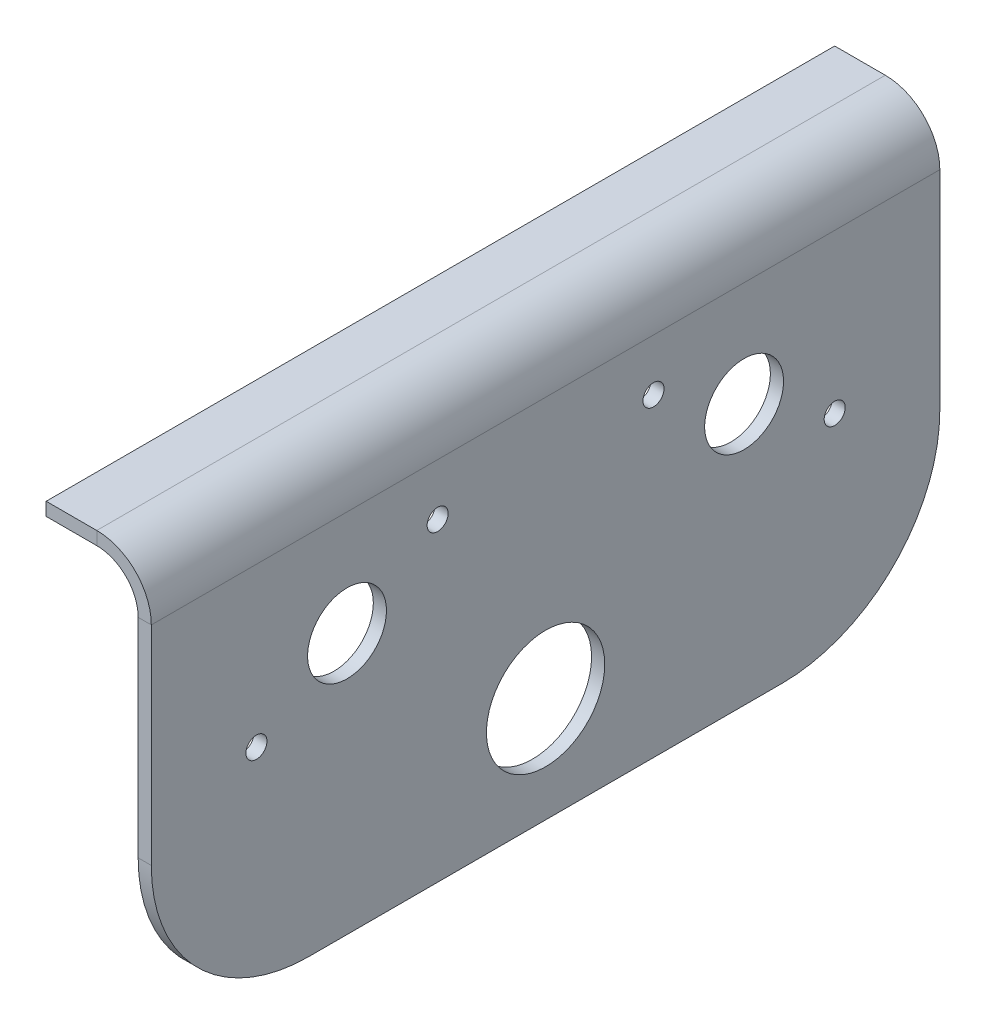
ISO-10303-21;
HEADER;
FILE_DESCRIPTION(('STEP AP214'),'2;1');
FILE_NAME('part.step','',(''),(''),'','','');
FILE_SCHEMA(('AUTOMOTIVE_DESIGN { 1 0 10303 214 1 1 1 1 }'));
ENDSEC;
DATA;
#1=APPLICATION_CONTEXT('core data for automotive mechanical design processes');
#2=APPLICATION_PROTOCOL_DEFINITION('international standard','automotive_design',2000,#1);
#3=PRODUCT_CONTEXT('',#1,'mechanical');
#4=PRODUCT('Part','Part','',(#3));
#5=PRODUCT_RELATED_PRODUCT_CATEGORY('part','',(#4));
#6=PRODUCT_DEFINITION_FORMATION('','',#4);
#7=PRODUCT_DEFINITION_CONTEXT('part definition',#1,'design');
#8=PRODUCT_DEFINITION('design','',#6,#7);
#9=PRODUCT_DEFINITION_SHAPE('','',#8);
#10=(LENGTH_UNIT() NAMED_UNIT(*) SI_UNIT(.MILLI.,.METRE.));
#11=(NAMED_UNIT(*) PLANE_ANGLE_UNIT() SI_UNIT($,.RADIAN.));
#12=(NAMED_UNIT(*) SI_UNIT($,.STERADIAN.) SOLID_ANGLE_UNIT());
#13=UNCERTAINTY_MEASURE_WITH_UNIT(LENGTH_MEASURE(1.E-05),#10,'distance_accuracy_value','');
#14=(GEOMETRIC_REPRESENTATION_CONTEXT(3) GLOBAL_UNCERTAINTY_ASSIGNED_CONTEXT((#13)) GLOBAL_UNIT_ASSIGNED_CONTEXT((#10,
#11,#12)) REPRESENTATION_CONTEXT('',''));
#15=CARTESIAN_POINT('',(0.,0.,0.));
#16=DIRECTION('',(0.,0.,1.));
#17=DIRECTION('',(1.,0.,0.));
#18=AXIS2_PLACEMENT_3D('',#15,#16,#17);
#19=CARTESIAN_POINT('',(3.175,-50.8,-95.25));
#20=DIRECTION('',(0.,0.,-1.));
#21=DIRECTION('',(0.,1.,0.));
#22=AXIS2_PLACEMENT_3D('',#19,#20,#21);
#23=PLANE('',#22);
#24=DIRECTION('',(0.,1.,0.));
#25=VECTOR('',#24,1.);
#26=CARTESIAN_POINT('',(3.175,-50.8,-95.25));
#27=LINE('',#26,#25);
#28=CARTESIAN_POINT('',(3.175,-12.7,-95.25));
#29=VERTEX_POINT('',#28);
#30=CARTESIAN_POINT('',(3.17499999999998,37.625,-95.25));
#31=VERTEX_POINT('',#30);
#32=EDGE_CURVE('E214',#29,#31,#27,.T.);
#33=ORIENTED_EDGE('',*,*,#32,.F.);
#34=DIRECTION('',(1.,0.,0.));
#35=VECTOR('',#34,1.);
#36=CARTESIAN_POINT('',(3.175,-12.7,-95.25));
#37=LINE('',#36,#35);
#38=CARTESIAN_POINT('',(0.,-12.7,-95.25));
#39=VERTEX_POINT('',#38);
#40=EDGE_CURVE('E80',#29,#39,#37,.F.);
#41=ORIENTED_EDGE('',*,*,#40,.T.);
#42=DIRECTION('',(0.,1.,0.));
#43=VECTOR('',#42,1.);
#44=CARTESIAN_POINT('',(0.,0.,-95.25));
#45=LINE('',#44,#43);
#46=CARTESIAN_POINT('',(0.,37.625,-95.25));
#47=VERTEX_POINT('',#46);
#48=EDGE_CURVE('E208',#39,#47,#45,.T.);
#49=ORIENTED_EDGE('',*,*,#48,.T.);
#50=DIRECTION('',(1.,0.,0.));
#51=VECTOR('',#50,1.);
#52=CARTESIAN_POINT('',(0.,37.625,-95.25));
#53=LINE('',#52,#51);
#54=EDGE_CURVE('E187',#47,#31,#53,.T.);
#55=ORIENTED_EDGE('',*,*,#54,.T.);
#56=EDGE_LOOP('',(#33,#41,#49,#55));
#57=FACE_BOUND('',#56,.T.);
#58=ADVANCED_FACE('F57',(#57),#23,.T.);
#59=CARTESIAN_POINT('',(3.175,0.,0.));
#60=DIRECTION('',(1.,0.,0.));
#61=DIRECTION('',(0.,0.,-1.));
#62=AXIS2_PLACEMENT_3D('',#59,#60,#61);
#63=PLANE('',#62);
#64=CARTESIAN_POINT('',(3.175,-0.664284450155228,-69.85));
#65=DIRECTION('',(1.,0.,0.));
#66=DIRECTION('',(0.,0.,-1.));
#67=AXIS2_PLACEMENT_3D('',#64,#65,#66);
#68=CIRCLE('',#67,2.54);
#69=CARTESIAN_POINT('',(3.175,-0.664284450155228,-72.39));
#70=VERTEX_POINT('',#69);
#71=EDGE_CURVE('E247',#70,#70,#68,.T.);
#72=ORIENTED_EDGE('',*,*,#71,.F.);
#73=EDGE_LOOP('',(#72));
#74=FACE_BOUND('',#73,.T.);
#75=CARTESIAN_POINT('',(3.175,25.1142844501553,-26.0766589640231));
#76=DIRECTION('',(1.,0.,0.));
#77=DIRECTION('',(0.,0.,-1.));
#78=AXIS2_PLACEMENT_3D('',#75,#76,#77);
#79=CIRCLE('',#78,2.54);
#80=CARTESIAN_POINT('',(3.175,25.1142844501553,-28.6166589640231));
#81=VERTEX_POINT('',#80);
#82=EDGE_CURVE('E243',#81,#81,#79,.T.);
#83=ORIENTED_EDGE('',*,*,#82,.F.);
#84=EDGE_LOOP('',(#83));
#85=FACE_BOUND('',#84,.T.);
#86=CARTESIAN_POINT('',(3.175,12.225,-47.9633294820115));
#87=DIRECTION('',(1.,0.,0.));
#88=DIRECTION('',(0.,0.,-1.));
#89=AXIS2_PLACEMENT_3D('',#86,#87,#88);
#90=CIRCLE('',#89,9.525);
#91=CARTESIAN_POINT('',(3.175,12.225,-57.4883294820115));
#92=VERTEX_POINT('',#91);
#93=EDGE_CURVE('E239',#92,#92,#90,.T.);
#94=ORIENTED_EDGE('',*,*,#93,.F.);
#95=EDGE_LOOP('',(#94));
#96=FACE_BOUND('',#95,.T.);
#97=CARTESIAN_POINT('',(3.175,-0.664284450155206,69.85));
#98=DIRECTION('',(1.,0.,0.));
#99=DIRECTION('',(0.,0.,-1.));
#100=AXIS2_PLACEMENT_3D('',#97,#98,#99);
#101=CIRCLE('',#100,2.54);
#102=CARTESIAN_POINT('',(3.175,-0.664284450155206,67.31));
#103=VERTEX_POINT('',#102);
#104=EDGE_CURVE('E235',#103,#103,#101,.T.);
#105=ORIENTED_EDGE('',*,*,#104,.F.);
#106=EDGE_LOOP('',(#105));
#107=FACE_BOUND('',#106,.T.);
#108=CARTESIAN_POINT('',(3.175,25.1142844501553,26.076658964023));
#109=DIRECTION('',(1.,0.,0.));
#110=DIRECTION('',(0.,0.,-1.));
#111=AXIS2_PLACEMENT_3D('',#108,#109,#110);
#112=CIRCLE('',#111,2.54);
#113=CARTESIAN_POINT('',(3.175,25.1142844501553,23.536658964023));
#114=VERTEX_POINT('',#113);
#115=EDGE_CURVE('E231',#114,#114,#112,.T.);
#116=ORIENTED_EDGE('',*,*,#115,.F.);
#117=EDGE_LOOP('',(#116));
#118=FACE_BOUND('',#117,.T.);
#119=CARTESIAN_POINT('',(3.175,12.225,47.9633294820115));
#120=DIRECTION('',(1.,0.,0.));
#121=DIRECTION('',(0.,0.,-1.));
#122=AXIS2_PLACEMENT_3D('',#119,#120,#121);
#123=CIRCLE('',#122,9.525);
#124=CARTESIAN_POINT('',(3.175,12.225,38.4383294820115));
#125=VERTEX_POINT('',#124);
#126=EDGE_CURVE('E227',#125,#125,#123,.T.);
#127=ORIENTED_EDGE('',*,*,#126,.F.);
#128=EDGE_LOOP('',(#127));
#129=FACE_BOUND('',#128,.T.);
#130=CARTESIAN_POINT('',(3.175,-25.4,0.));
#131=DIRECTION('',(1.,0.,0.));
#132=DIRECTION('',(0.,0.,-1.));
#133=AXIS2_PLACEMENT_3D('',#130,#131,#132);
#134=CIRCLE('',#133,14.2875);
#135=CARTESIAN_POINT('',(3.175,-25.4,-14.2875));
#136=VERTEX_POINT('',#135);
#137=EDGE_CURVE('E204',#136,#136,#134,.T.);
#138=ORIENTED_EDGE('',*,*,#137,.F.);
#139=EDGE_LOOP('',(#138));
#140=FACE_BOUND('',#139,.T.);
#141=DIRECTION('',(0.,0.,-1.));
#142=VECTOR('',#141,1.);
#143=CARTESIAN_POINT('',(3.175,-50.8,-95.25));
#144=LINE('',#143,#142);
#145=CARTESIAN_POINT('',(3.175,-50.8,57.15));
#146=VERTEX_POINT('',#145);
#147=CARTESIAN_POINT('',(3.175,-50.8,-57.15));
#148=VERTEX_POINT('',#147);
#149=EDGE_CURVE('E211',#146,#148,#144,.T.);
#150=ORIENTED_EDGE('',*,*,#149,.T.);
#151=CARTESIAN_POINT('',(3.175,-12.7,-57.15));
#152=DIRECTION('',(1.,0.,0.));
#153=DIRECTION('',(0.,0.,-1.));
#154=AXIS2_PLACEMENT_3D('',#151,#152,#153);
#155=CIRCLE('',#154,38.1);
#156=EDGE_CURVE('E254',#148,#29,#155,.T.);
#157=ORIENTED_EDGE('',*,*,#156,.T.);
#158=ORIENTED_EDGE('',*,*,#32,.T.);
#159=DIRECTION('',(0.,0.,-1.));
#160=VECTOR('',#159,1.);
#161=CARTESIAN_POINT('',(3.17499999999998,37.625,-95.25));
#162=LINE('',#161,#160);
#163=CARTESIAN_POINT('',(3.175,37.625,95.25));
#164=VERTEX_POINT('',#163);
#165=EDGE_CURVE('E180',#31,#164,#162,.F.);
#166=ORIENTED_EDGE('',*,*,#165,.T.);
#167=DIRECTION('',(0.,-1.,0.));
#168=VECTOR('',#167,1.);
#169=CARTESIAN_POINT('',(3.175,-50.8,95.25));
#170=LINE('',#169,#168);
#171=CARTESIAN_POINT('',(3.175,-12.7,95.25));
#172=VERTEX_POINT('',#171);
#173=EDGE_CURVE('E207',#164,#172,#170,.T.);
#174=ORIENTED_EDGE('',*,*,#173,.T.);
#175=CARTESIAN_POINT('',(3.175,-12.7,57.15));
#176=DIRECTION('',(1.,0.,0.));
#177=DIRECTION('',(0.,0.,-1.));
#178=AXIS2_PLACEMENT_3D('',#175,#176,#177);
#179=CIRCLE('',#178,38.1);
#180=EDGE_CURVE('E252',#172,#146,#179,.T.);
#181=ORIENTED_EDGE('',*,*,#180,.T.);
#182=EDGE_LOOP('',(#150,#157,#158,#166,#174,#181));
#183=FACE_BOUND('',#182,.T.);
#184=ADVANCED_FACE('F268',(#74,#85,#96,#107,#118,#129,#140,#183),#63,.T.);
#185=CARTESIAN_POINT('',(0.,0.,0.));
#186=DIRECTION('',(1.,0.,0.));
#187=DIRECTION('',(0.,0.,-1.));
#188=AXIS2_PLACEMENT_3D('',#185,#186,#187);
#189=PLANE('',#188);
#190=CARTESIAN_POINT('',(0.,-0.664284450155228,-69.85));
#191=DIRECTION('',(1.,0.,0.));
#192=DIRECTION('',(0.,0.,-1.));
#193=AXIS2_PLACEMENT_3D('',#190,#191,#192);
#194=CIRCLE('',#193,2.54);
#195=CARTESIAN_POINT('',(0.,-0.664284450155228,-72.39));
#196=VERTEX_POINT('',#195);
#197=EDGE_CURVE('E244',#196,#196,#194,.T.);
#198=ORIENTED_EDGE('',*,*,#197,.T.);
#199=EDGE_LOOP('',(#198));
#200=FACE_BOUND('',#199,.T.);
#201=CARTESIAN_POINT('',(0.,25.1142844501553,-26.0766589640231));
#202=DIRECTION('',(1.,0.,0.));
#203=DIRECTION('',(0.,0.,-1.));
#204=AXIS2_PLACEMENT_3D('',#201,#202,#203);
#205=CIRCLE('',#204,2.54);
#206=CARTESIAN_POINT('',(0.,25.1142844501553,-28.6166589640231));
#207=VERTEX_POINT('',#206);
#208=EDGE_CURVE('E240',#207,#207,#205,.T.);
#209=ORIENTED_EDGE('',*,*,#208,.T.);
#210=EDGE_LOOP('',(#209));
#211=FACE_BOUND('',#210,.T.);
#212=CARTESIAN_POINT('',(0.,12.225,-47.9633294820115));
#213=DIRECTION('',(1.,0.,0.));
#214=DIRECTION('',(0.,0.,-1.));
#215=AXIS2_PLACEMENT_3D('',#212,#213,#214);
#216=CIRCLE('',#215,9.525);
#217=CARTESIAN_POINT('',(0.,12.225,-57.4883294820115));
#218=VERTEX_POINT('',#217);
#219=EDGE_CURVE('E236',#218,#218,#216,.T.);
#220=ORIENTED_EDGE('',*,*,#219,.T.);
#221=EDGE_LOOP('',(#220));
#222=FACE_BOUND('',#221,.T.);
#223=CARTESIAN_POINT('',(0.,-0.664284450155206,69.85));
#224=DIRECTION('',(1.,0.,0.));
#225=DIRECTION('',(0.,0.,-1.));
#226=AXIS2_PLACEMENT_3D('',#223,#224,#225);
#227=CIRCLE('',#226,2.54);
#228=CARTESIAN_POINT('',(0.,-0.664284450155206,67.31));
#229=VERTEX_POINT('',#228);
#230=EDGE_CURVE('E232',#229,#229,#227,.T.);
#231=ORIENTED_EDGE('',*,*,#230,.T.);
#232=EDGE_LOOP('',(#231));
#233=FACE_BOUND('',#232,.T.);
#234=CARTESIAN_POINT('',(0.,25.1142844501553,26.076658964023));
#235=DIRECTION('',(1.,0.,0.));
#236=DIRECTION('',(0.,0.,-1.));
#237=AXIS2_PLACEMENT_3D('',#234,#235,#236);
#238=CIRCLE('',#237,2.54);
#239=CARTESIAN_POINT('',(0.,25.1142844501553,23.536658964023));
#240=VERTEX_POINT('',#239);
#241=EDGE_CURVE('E228',#240,#240,#238,.T.);
#242=ORIENTED_EDGE('',*,*,#241,.T.);
#243=EDGE_LOOP('',(#242));
#244=FACE_BOUND('',#243,.T.);
#245=CARTESIAN_POINT('',(0.,12.225,47.9633294820115));
#246=DIRECTION('',(1.,0.,0.));
#247=DIRECTION('',(0.,0.,-1.));
#248=AXIS2_PLACEMENT_3D('',#245,#246,#247);
#249=CIRCLE('',#248,9.525);
#250=CARTESIAN_POINT('',(0.,12.225,38.4383294820115));
#251=VERTEX_POINT('',#250);
#252=EDGE_CURVE('E179',#251,#251,#249,.T.);
#253=ORIENTED_EDGE('',*,*,#252,.T.);
#254=EDGE_LOOP('',(#253));
#255=FACE_BOUND('',#254,.T.);
#256=CARTESIAN_POINT('',(0.,-25.4,0.));
#257=DIRECTION('',(1.,0.,0.));
#258=DIRECTION('',(0.,0.,-1.));
#259=AXIS2_PLACEMENT_3D('',#256,#257,#258);
#260=CIRCLE('',#259,14.2875);
#261=CARTESIAN_POINT('',(0.,-25.4,-14.2875));
#262=VERTEX_POINT('',#261);
#263=EDGE_CURVE('E201',#262,#262,#260,.T.);
#264=ORIENTED_EDGE('',*,*,#263,.T.);
#265=EDGE_LOOP('',(#264));
#266=FACE_BOUND('',#265,.T.);
#267=ORIENTED_EDGE('',*,*,#48,.F.);
#268=CARTESIAN_POINT('',(0.,-12.7,-57.15));
#269=DIRECTION('',(1.,0.,0.));
#270=DIRECTION('',(0.,0.,-1.));
#271=AXIS2_PLACEMENT_3D('',#268,#269,#270);
#272=CIRCLE('',#271,38.1);
#273=CARTESIAN_POINT('',(0.,-50.8,-57.15));
#274=VERTEX_POINT('',#273);
#275=EDGE_CURVE('E65',#39,#274,#272,.F.);
#276=ORIENTED_EDGE('',*,*,#275,.T.);
#277=DIRECTION('',(0.,0.,-1.));
#278=VECTOR('',#277,1.);
#279=CARTESIAN_POINT('',(0.,-50.8,0.));
#280=LINE('',#279,#278);
#281=CARTESIAN_POINT('',(0.,-50.8,57.15));
#282=VERTEX_POINT('',#281);
#283=EDGE_CURVE('E221',#282,#274,#280,.T.);
#284=ORIENTED_EDGE('',*,*,#283,.F.);
#285=CARTESIAN_POINT('',(0.,-12.7,57.15));
#286=DIRECTION('',(1.,0.,0.));
#287=DIRECTION('',(0.,0.,-1.));
#288=AXIS2_PLACEMENT_3D('',#285,#286,#287);
#289=CIRCLE('',#288,38.1);
#290=CARTESIAN_POINT('',(0.,-12.7,95.25));
#291=VERTEX_POINT('',#290);
#292=EDGE_CURVE('E72',#282,#291,#289,.F.);
#293=ORIENTED_EDGE('',*,*,#292,.T.);
#294=DIRECTION('',(0.,1.,0.));
#295=VECTOR('',#294,1.);
#296=CARTESIAN_POINT('',(0.,0.,95.25));
#297=LINE('',#296,#295);
#298=CARTESIAN_POINT('',(0.,37.625,95.25));
#299=VERTEX_POINT('',#298);
#300=EDGE_CURVE('E219',#299,#291,#297,.F.);
#301=ORIENTED_EDGE('',*,*,#300,.F.);
#302=DIRECTION('',(0.,0.,-1.));
#303=VECTOR('',#302,1.);
#304=CARTESIAN_POINT('',(0.,37.625,-95.25));
#305=LINE('',#304,#303);
#306=EDGE_CURVE('E193',#47,#299,#305,.F.);
#307=ORIENTED_EDGE('',*,*,#306,.F.);
#308=EDGE_LOOP('',(#267,#276,#284,#293,#301,#307));
#309=FACE_BOUND('',#308,.T.);
#310=ADVANCED_FACE('F258',(#200,#211,#222,#233,#244,#255,#266,#309),#189,.F.);
#311=CARTESIAN_POINT('',(3.175,-50.8,95.25));
#312=DIRECTION('',(0.,0.,1.));
#313=DIRECTION('',(0.,-1.,0.));
#314=AXIS2_PLACEMENT_3D('',#311,#312,#313);
#315=PLANE('',#314);
#316=ORIENTED_EDGE('',*,*,#300,.T.);
#317=DIRECTION('',(1.,0.,0.));
#318=VECTOR('',#317,1.);
#319=CARTESIAN_POINT('',(3.175,-12.7,95.25));
#320=LINE('',#319,#318);
#321=EDGE_CURVE('E13',#291,#172,#320,.T.);
#322=ORIENTED_EDGE('',*,*,#321,.T.);
#323=ORIENTED_EDGE('',*,*,#173,.F.);
#324=DIRECTION('',(1.,0.,0.));
#325=VECTOR('',#324,1.);
#326=CARTESIAN_POINT('',(0.,37.625,95.25));
#327=LINE('',#326,#325);
#328=EDGE_CURVE('E198',#299,#164,#327,.T.);
#329=ORIENTED_EDGE('',*,*,#328,.F.);
#330=EDGE_LOOP('',(#316,#322,#323,#329));
#331=FACE_BOUND('',#330,.T.);
#332=ADVANCED_FACE('F283',(#331),#315,.T.);
#333=CARTESIAN_POINT('',(3.175,-25.4,0.));
#334=DIRECTION('',(1.,0.,0.));
#335=DIRECTION('',(0.,0.,-1.));
#336=AXIS2_PLACEMENT_3D('',#333,#334,#335);
#337=CYLINDRICAL_SURFACE('',#336,14.2875);
#338=ORIENTED_EDGE('',*,*,#137,.T.);
#339=EDGE_LOOP('',(#338));
#340=FACE_BOUND('',#339,.T.);
#341=ORIENTED_EDGE('',*,*,#263,.F.);
#342=EDGE_LOOP('',(#341));
#343=FACE_BOUND('',#342,.T.);
#344=ADVANCED_FACE('F323',(#340,#343),#337,.F.);
#345=CARTESIAN_POINT('',(3.175,-50.8,-95.25));
#346=DIRECTION('',(0.,-1.,0.));
#347=DIRECTION('',(0.,0.,-1.));
#348=AXIS2_PLACEMENT_3D('',#345,#346,#347);
#349=PLANE('',#348);
#350=ORIENTED_EDGE('',*,*,#283,.T.);
#351=DIRECTION('',(1.,0.,0.));
#352=VECTOR('',#351,1.);
#353=CARTESIAN_POINT('',(3.175,-50.8,-57.15));
#354=LINE('',#353,#352);
#355=EDGE_CURVE('E249',#274,#148,#354,.T.);
#356=ORIENTED_EDGE('',*,*,#355,.T.);
#357=ORIENTED_EDGE('',*,*,#149,.F.);
#358=DIRECTION('',(1.,0.,0.));
#359=VECTOR('',#358,1.);
#360=CARTESIAN_POINT('',(3.175,-50.8,57.15));
#361=LINE('',#360,#359);
#362=EDGE_CURVE('E216',#146,#282,#361,.F.);
#363=ORIENTED_EDGE('',*,*,#362,.T.);
#364=EDGE_LOOP('',(#350,#356,#357,#363));
#365=FACE_BOUND('',#364,.T.);
#366=ADVANCED_FACE('F263',(#365),#349,.T.);
#367=CARTESIAN_POINT('',(-10.,37.625,95.25));
#368=DIRECTION('',(0.,0.,1.));
#369=DIRECTION('',(1.,0.,0.));
#370=AXIS2_PLACEMENT_3D('',#367,#368,#369);
#371=PLANE('',#370);
#372=DIRECTION('',(0.,-1.,0.));
#373=VECTOR('',#372,1.);
#374=CARTESIAN_POINT('',(-9.99999999999996,50.8,95.25));
#375=LINE('',#374,#373);
#376=CARTESIAN_POINT('',(-9.99999999999997,47.625,95.25));
#377=VERTEX_POINT('',#376);
#378=CARTESIAN_POINT('',(-9.99999999999996,50.8,95.25));
#379=VERTEX_POINT('',#378);
#380=EDGE_CURVE('E161',#377,#379,#375,.F.);
#381=ORIENTED_EDGE('',*,*,#380,.F.);
#382=CARTESIAN_POINT('',(-10.,37.625,95.25));
#383=DIRECTION('',(0.,0.,-1.));
#384=DIRECTION('',(-1.,0.,0.));
#385=AXIS2_PLACEMENT_3D('',#382,#383,#384);
#386=CIRCLE('',#385,9.99999999999999);
#387=EDGE_CURVE('E190',#299,#377,#386,.F.);
#388=ORIENTED_EDGE('',*,*,#387,.F.);
#389=ORIENTED_EDGE('',*,*,#328,.T.);
#390=CARTESIAN_POINT('',(-10.,37.625,95.25));
#391=DIRECTION('',(0.,0.,-1.));
#392=DIRECTION('',(-1.,0.,0.));
#393=AXIS2_PLACEMENT_3D('',#390,#391,#392);
#394=CIRCLE('',#393,13.175);
#395=EDGE_CURVE('E183',#164,#379,#394,.F.);
#396=ORIENTED_EDGE('',*,*,#395,.T.);
#397=EDGE_LOOP('',(#381,#388,#389,#396));
#398=FACE_BOUND('',#397,.T.);
#399=ADVANCED_FACE('F285',(#398),#371,.T.);
#400=CARTESIAN_POINT('',(-10.,37.625,-95.25));
#401=DIRECTION('',(0.,0.,1.));
#402=DIRECTION('',(1.,0.,0.));
#403=AXIS2_PLACEMENT_3D('',#400,#401,#402);
#404=PLANE('',#403);
#405=CARTESIAN_POINT('',(-10.,37.625,-95.25));
#406=DIRECTION('',(0.,0.,-1.));
#407=DIRECTION('',(-1.,0.,0.));
#408=AXIS2_PLACEMENT_3D('',#405,#406,#407);
#409=CIRCLE('',#408,9.99999999999999);
#410=CARTESIAN_POINT('',(-9.99999999999997,47.625,-95.25));
#411=VERTEX_POINT('',#410);
#412=EDGE_CURVE('E195',#411,#47,#409,.T.);
#413=ORIENTED_EDGE('',*,*,#412,.F.);
#414=DIRECTION('',(0.,-1.,0.));
#415=VECTOR('',#414,1.);
#416=CARTESIAN_POINT('',(-9.99999999999997,47.6250000000001,-95.25));
#417=LINE('',#416,#415);
#418=CARTESIAN_POINT('',(-9.99999999999996,50.8,-95.25));
#419=VERTEX_POINT('',#418);
#420=EDGE_CURVE('E173',#411,#419,#417,.F.);
#421=ORIENTED_EDGE('',*,*,#420,.T.);
#422=CARTESIAN_POINT('',(-10.,37.625,-95.25));
#423=DIRECTION('',(0.,0.,-1.));
#424=DIRECTION('',(-1.,0.,0.));
#425=AXIS2_PLACEMENT_3D('',#422,#423,#424);
#426=CIRCLE('',#425,13.175);
#427=EDGE_CURVE('E184',#419,#31,#426,.T.);
#428=ORIENTED_EDGE('',*,*,#427,.T.);
#429=ORIENTED_EDGE('',*,*,#54,.F.);
#430=EDGE_LOOP('',(#413,#421,#428,#429));
#431=FACE_BOUND('',#430,.T.);
#432=ADVANCED_FACE('F273',(#431),#404,.F.);
#433=CARTESIAN_POINT('',(-10.,37.625,-95.25));
#434=DIRECTION('',(0.,0.,-1.));
#435=DIRECTION('',(0.,1.,0.));
#436=AXIS2_PLACEMENT_3D('',#433,#434,#435);
#437=CYLINDRICAL_SURFACE('',#436,13.175);
#438=ORIENTED_EDGE('',*,*,#165,.F.);
#439=ORIENTED_EDGE('',*,*,#427,.F.);
#440=DIRECTION('',(0.,0.,-1.));
#441=VECTOR('',#440,1.);
#442=CARTESIAN_POINT('',(-9.99999999999996,50.8,95.25));
#443=LINE('',#442,#441);
#444=EDGE_CURVE('E171',#419,#379,#443,.F.);
#445=ORIENTED_EDGE('',*,*,#444,.T.);
#446=ORIENTED_EDGE('',*,*,#395,.F.);
#447=EDGE_LOOP('',(#438,#439,#445,#446));
#448=FACE_BOUND('',#447,.T.);
#449=ADVANCED_FACE('F287',(#448),#437,.T.);
#450=CARTESIAN_POINT('',(-10.,37.625,-95.25));
#451=DIRECTION('',(0.,0.,-1.));
#452=DIRECTION('',(0.,1.,0.));
#453=AXIS2_PLACEMENT_3D('',#450,#451,#452);
#454=CYLINDRICAL_SURFACE('',#453,9.99999999999999);
#455=ORIENTED_EDGE('',*,*,#306,.T.);
#456=ORIENTED_EDGE('',*,*,#387,.T.);
#457=DIRECTION('',(0.,0.,-1.));
#458=VECTOR('',#457,1.);
#459=CARTESIAN_POINT('',(-9.99999999999997,47.625,95.25));
#460=LINE('',#459,#458);
#461=EDGE_CURVE('E176',#377,#411,#460,.T.);
#462=ORIENTED_EDGE('',*,*,#461,.T.);
#463=ORIENTED_EDGE('',*,*,#412,.T.);
#464=EDGE_LOOP('',(#455,#456,#462,#463));
#465=FACE_BOUND('',#464,.T.);
#466=ADVANCED_FACE('F276',(#465),#454,.F.);
#467=CARTESIAN_POINT('',(-22.225,50.8000000000001,-95.25));
#468=DIRECTION('',(0.,0.,1.));
#469=DIRECTION('',(1.,0.,0.));
#470=AXIS2_PLACEMENT_3D('',#467,#468,#469);
#471=PLANE('',#470);
#472=ORIENTED_EDGE('',*,*,#420,.F.);
#473=DIRECTION('',(1.,0.,0.));
#474=VECTOR('',#473,1.);
#475=CARTESIAN_POINT('',(-22.225,47.6250000000001,-95.25));
#476=LINE('',#475,#474);
#477=CARTESIAN_POINT('',(-22.225,47.6250000000001,-95.25));
#478=VERTEX_POINT('',#477);
#479=EDGE_CURVE('E169',#411,#478,#476,.F.);
#480=ORIENTED_EDGE('',*,*,#479,.T.);
#481=DIRECTION('',(0.,-1.,0.));
#482=VECTOR('',#481,1.);
#483=CARTESIAN_POINT('',(-22.225,50.8000000000001,-95.25));
#484=LINE('',#483,#482);
#485=CARTESIAN_POINT('',(-22.225,50.8000000000001,-95.25));
#486=VERTEX_POINT('',#485);
#487=EDGE_CURVE('E157',#486,#478,#484,.T.);
#488=ORIENTED_EDGE('',*,*,#487,.F.);
#489=DIRECTION('',(-1.,0.,0.));
#490=VECTOR('',#489,1.);
#491=CARTESIAN_POINT('',(2.45025304868271E-13,50.8,-95.25));
#492=LINE('',#491,#490);
#493=EDGE_CURVE('E144',#419,#486,#492,.T.);
#494=ORIENTED_EDGE('',*,*,#493,.F.);
#495=EDGE_LOOP('',(#472,#480,#488,#494));
#496=FACE_BOUND('',#495,.T.);
#497=ADVANCED_FACE('F289',(#496),#471,.F.);
#498=CARTESIAN_POINT('',(0.,50.8,95.25));
#499=DIRECTION('',(0.,0.,-1.));
#500=DIRECTION('',(-1.,0.,0.));
#501=AXIS2_PLACEMENT_3D('',#498,#499,#500);
#502=PLANE('',#501);
#503=ORIENTED_EDGE('',*,*,#380,.T.);
#504=DIRECTION('',(1.,0.,0.));
#505=VECTOR('',#504,1.);
#506=CARTESIAN_POINT('',(1.26072837944147E-13,50.8,95.25));
#507=LINE('',#506,#505);
#508=CARTESIAN_POINT('',(-22.225,50.8000000000001,95.25));
#509=VERTEX_POINT('',#508);
#510=EDGE_CURVE('E142',#509,#379,#507,.T.);
#511=ORIENTED_EDGE('',*,*,#510,.F.);
#512=DIRECTION('',(0.,-1.,0.));
#513=VECTOR('',#512,1.);
#514=CARTESIAN_POINT('',(-22.225,50.8000000000001,95.25));
#515=LINE('',#514,#513);
#516=CARTESIAN_POINT('',(-22.225,47.6250000000001,95.25));
#517=VERTEX_POINT('',#516);
#518=EDGE_CURVE('E150',#509,#517,#515,.T.);
#519=ORIENTED_EDGE('',*,*,#518,.T.);
#520=DIRECTION('',(-1.,0.,0.));
#521=VECTOR('',#520,1.);
#522=CARTESIAN_POINT('',(0.,47.625,95.25));
#523=LINE('',#522,#521);
#524=EDGE_CURVE('E166',#517,#377,#523,.F.);
#525=ORIENTED_EDGE('',*,*,#524,.T.);
#526=EDGE_LOOP('',(#503,#511,#519,#525));
#527=FACE_BOUND('',#526,.T.);
#528=ADVANCED_FACE('F160',(#527),#502,.F.);
#529=CARTESIAN_POINT('',(1.85549071406209E-13,50.8,0.));
#530=DIRECTION('',(0.,-1.,0.));
#531=DIRECTION('',(1.,0.,0.));
#532=AXIS2_PLACEMENT_3D('',#529,#530,#531);
#533=PLANE('',#532);
#534=ORIENTED_EDGE('',*,*,#444,.F.);
#535=ORIENTED_EDGE('',*,*,#493,.T.);
#536=DIRECTION('',(0.,0.,1.));
#537=VECTOR('',#536,1.);
#538=CARTESIAN_POINT('',(-22.225,50.8000000000001,0.));
#539=LINE('',#538,#537);
#540=EDGE_CURVE('E137',#486,#509,#539,.T.);
#541=ORIENTED_EDGE('',*,*,#540,.T.);
#542=ORIENTED_EDGE('',*,*,#510,.T.);
#543=EDGE_LOOP('',(#534,#535,#541,#542));
#544=FACE_BOUND('',#543,.T.);
#545=ADVANCED_FACE('F140',(#544),#533,.F.);
#546=CARTESIAN_POINT('',(1.74463618155382E-13,47.625,0.));
#547=DIRECTION('',(0.,-1.,0.));
#548=DIRECTION('',(1.,0.,0.));
#549=AXIS2_PLACEMENT_3D('',#546,#547,#548);
#550=PLANE('',#549);
#551=ORIENTED_EDGE('',*,*,#479,.F.);
#552=ORIENTED_EDGE('',*,*,#461,.F.);
#553=ORIENTED_EDGE('',*,*,#524,.F.);
#554=DIRECTION('',(0.,0.,-1.));
#555=VECTOR('',#554,1.);
#556=CARTESIAN_POINT('',(-22.225,47.6250000000001,95.25));
#557=LINE('',#556,#555);
#558=EDGE_CURVE('E153',#478,#517,#557,.F.);
#559=ORIENTED_EDGE('',*,*,#558,.F.);
#560=EDGE_LOOP('',(#551,#552,#553,#559));
#561=FACE_BOUND('',#560,.T.);
#562=ADVANCED_FACE('F375',(#561),#550,.T.);
#563=CARTESIAN_POINT('',(-22.225,50.8000000000001,95.25));
#564=DIRECTION('',(1.,0.,0.));
#565=DIRECTION('',(0.,1.,0.));
#566=AXIS2_PLACEMENT_3D('',#563,#564,#565);
#567=PLANE('',#566);
#568=ORIENTED_EDGE('',*,*,#558,.T.);
#569=ORIENTED_EDGE('',*,*,#518,.F.);
#570=ORIENTED_EDGE('',*,*,#540,.F.);
#571=ORIENTED_EDGE('',*,*,#487,.T.);
#572=EDGE_LOOP('',(#568,#569,#570,#571));
#573=FACE_BOUND('',#572,.T.);
#574=ADVANCED_FACE('F151',(#573),#567,.F.);
#575=CARTESIAN_POINT('',(-4.445,12.225,47.9633294820115));
#576=DIRECTION('',(1.,0.,0.));
#577=DIRECTION('',(0.,0.,-1.));
#578=AXIS2_PLACEMENT_3D('',#575,#576,#577);
#579=CYLINDRICAL_SURFACE('',#578,9.525);
#580=ORIENTED_EDGE('',*,*,#126,.T.);
#581=EDGE_LOOP('',(#580));
#582=FACE_BOUND('',#581,.T.);
#583=ORIENTED_EDGE('',*,*,#252,.F.);
#584=EDGE_LOOP('',(#583));
#585=FACE_BOUND('',#584,.T.);
#586=ADVANCED_FACE('F368',(#582,#585),#579,.F.);
#587=CARTESIAN_POINT('',(-4.445,25.1142844501553,26.076658964023));
#588=DIRECTION('',(1.,0.,0.));
#589=DIRECTION('',(0.,0.,-1.));
#590=AXIS2_PLACEMENT_3D('',#587,#588,#589);
#591=CYLINDRICAL_SURFACE('',#590,2.54);
#592=ORIENTED_EDGE('',*,*,#115,.T.);
#593=EDGE_LOOP('',(#592));
#594=FACE_BOUND('',#593,.T.);
#595=ORIENTED_EDGE('',*,*,#241,.F.);
#596=EDGE_LOOP('',(#595));
#597=FACE_BOUND('',#596,.T.);
#598=ADVANCED_FACE('F364',(#594,#597),#591,.F.);
#599=CARTESIAN_POINT('',(-4.445,-0.664284450155206,69.85));
#600=DIRECTION('',(1.,0.,0.));
#601=DIRECTION('',(0.,0.,-1.));
#602=AXIS2_PLACEMENT_3D('',#599,#600,#601);
#603=CYLINDRICAL_SURFACE('',#602,2.54);
#604=ORIENTED_EDGE('',*,*,#104,.T.);
#605=EDGE_LOOP('',(#604));
#606=FACE_BOUND('',#605,.T.);
#607=ORIENTED_EDGE('',*,*,#230,.F.);
#608=EDGE_LOOP('',(#607));
#609=FACE_BOUND('',#608,.T.);
#610=ADVANCED_FACE('F360',(#606,#609),#603,.F.);
#611=CARTESIAN_POINT('',(-4.445,12.225,-47.9633294820115));
#612=DIRECTION('',(1.,0.,0.));
#613=DIRECTION('',(0.,0.,-1.));
#614=AXIS2_PLACEMENT_3D('',#611,#612,#613);
#615=CYLINDRICAL_SURFACE('',#614,9.525);
#616=ORIENTED_EDGE('',*,*,#93,.T.);
#617=EDGE_LOOP('',(#616));
#618=FACE_BOUND('',#617,.T.);
#619=ORIENTED_EDGE('',*,*,#219,.F.);
#620=EDGE_LOOP('',(#619));
#621=FACE_BOUND('',#620,.T.);
#622=ADVANCED_FACE('F354',(#618,#621),#615,.F.);
#623=CARTESIAN_POINT('',(-4.445,25.1142844501553,-26.0766589640231));
#624=DIRECTION('',(1.,0.,0.));
#625=DIRECTION('',(0.,0.,-1.));
#626=AXIS2_PLACEMENT_3D('',#623,#624,#625);
#627=CYLINDRICAL_SURFACE('',#626,2.54);
#628=ORIENTED_EDGE('',*,*,#82,.T.);
#629=EDGE_LOOP('',(#628));
#630=FACE_BOUND('',#629,.T.);
#631=ORIENTED_EDGE('',*,*,#208,.F.);
#632=EDGE_LOOP('',(#631));
#633=FACE_BOUND('',#632,.T.);
#634=ADVANCED_FACE('F350',(#630,#633),#627,.F.);
#635=CARTESIAN_POINT('',(-4.445,-0.664284450155228,-69.85));
#636=DIRECTION('',(1.,0.,0.));
#637=DIRECTION('',(0.,0.,-1.));
#638=AXIS2_PLACEMENT_3D('',#635,#636,#637);
#639=CYLINDRICAL_SURFACE('',#638,2.54);
#640=ORIENTED_EDGE('',*,*,#71,.T.);
#641=EDGE_LOOP('',(#640));
#642=FACE_BOUND('',#641,.T.);
#643=ORIENTED_EDGE('',*,*,#197,.F.);
#644=EDGE_LOOP('',(#643));
#645=FACE_BOUND('',#644,.T.);
#646=ADVANCED_FACE('F305',(#642,#645),#639,.F.);
#647=CARTESIAN_POINT('',(3.175,-12.7,-57.15));
#648=DIRECTION('',(1.,0.,0.));
#649=DIRECTION('',(0.,0.,-1.));
#650=AXIS2_PLACEMENT_3D('',#647,#648,#649);
#651=CYLINDRICAL_SURFACE('',#650,38.1);
#652=ORIENTED_EDGE('',*,*,#275,.F.);
#653=ORIENTED_EDGE('',*,*,#40,.F.);
#654=ORIENTED_EDGE('',*,*,#156,.F.);
#655=ORIENTED_EDGE('',*,*,#355,.F.);
#656=EDGE_LOOP('',(#652,#653,#654,#655));
#657=FACE_BOUND('',#656,.T.);
#658=ADVANCED_FACE('F266',(#657),#651,.T.);
#659=CARTESIAN_POINT('',(3.175,-12.7,57.15));
#660=DIRECTION('',(1.,0.,0.));
#661=DIRECTION('',(0.,0.,-1.));
#662=AXIS2_PLACEMENT_3D('',#659,#660,#661);
#663=CYLINDRICAL_SURFACE('',#662,38.1);
#664=ORIENTED_EDGE('',*,*,#292,.F.);
#665=ORIENTED_EDGE('',*,*,#362,.F.);
#666=ORIENTED_EDGE('',*,*,#180,.F.);
#667=ORIENTED_EDGE('',*,*,#321,.F.);
#668=EDGE_LOOP('',(#664,#665,#666,#667));
#669=FACE_BOUND('',#668,.T.);
#670=ADVANCED_FACE('F59',(#669),#663,.T.);
#671=CLOSED_SHELL('',(#58,#184,#310,#332,#344,#366,#399,#432,#449,#466,#497,#528,#545,#562,#574,
#586,#598,#610,#622,#634,#646,#658,#670));
#672=MANIFOLD_SOLID_BREP('B2',#671);
#673=ADVANCED_BREP_SHAPE_REPRESENTATION('',(#18,#672),#14);
#674=SHAPE_DEFINITION_REPRESENTATION(#9,#673);
ENDSEC;
END-ISO-10303-21;
